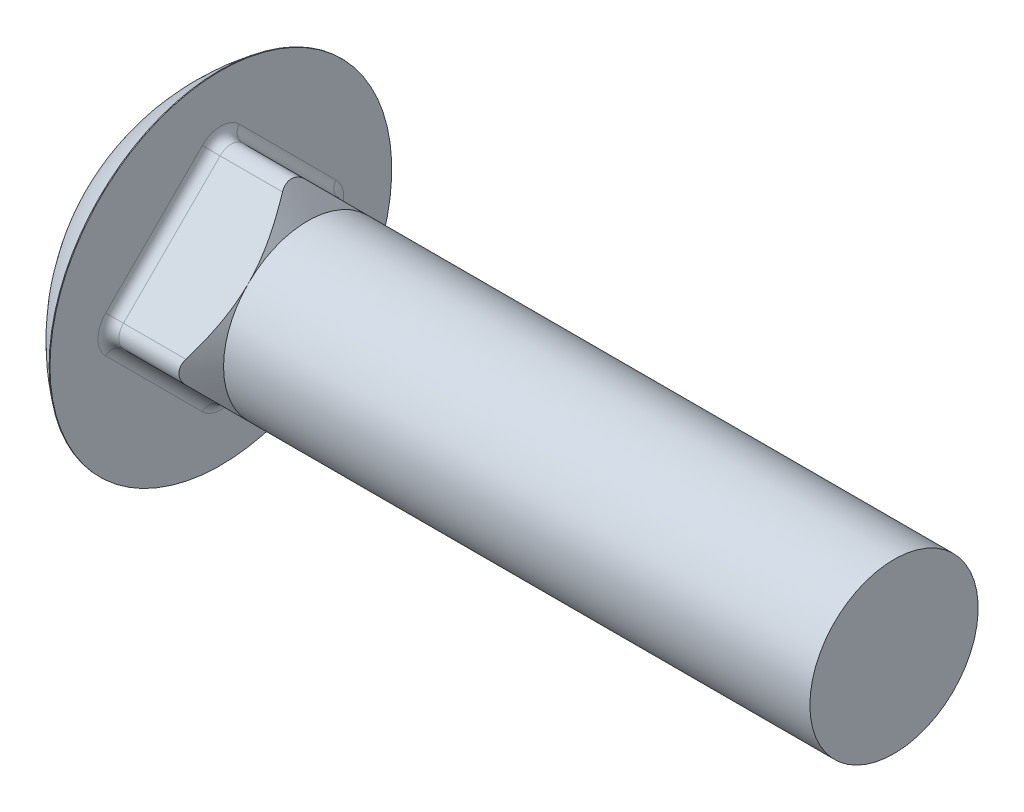
ISO-10303-21;
HEADER;
FILE_DESCRIPTION(('STEP AP214'),'2;1');
FILE_NAME('part.step','',(''),(''),'','','');
FILE_SCHEMA(('AUTOMOTIVE_DESIGN { 1 0 10303 214 1 1 1 1 }'));
ENDSEC;
DATA;
#1=APPLICATION_CONTEXT('core data for automotive mechanical design processes');
#2=APPLICATION_PROTOCOL_DEFINITION('international standard','automotive_design',2000,#1);
#3=PRODUCT_CONTEXT('',#1,'mechanical');
#4=PRODUCT('Part','Part','',(#3));
#5=PRODUCT_RELATED_PRODUCT_CATEGORY('part','',(#4));
#6=PRODUCT_DEFINITION_FORMATION('','',#4);
#7=PRODUCT_DEFINITION_CONTEXT('part definition',#1,'design');
#8=PRODUCT_DEFINITION('design','',#6,#7);
#9=PRODUCT_DEFINITION_SHAPE('','',#8);
#10=(LENGTH_UNIT() NAMED_UNIT(*) SI_UNIT(.MILLI.,.METRE.));
#11=(NAMED_UNIT(*) PLANE_ANGLE_UNIT() SI_UNIT($,.RADIAN.));
#12=(NAMED_UNIT(*) SI_UNIT($,.STERADIAN.) SOLID_ANGLE_UNIT());
#13=UNCERTAINTY_MEASURE_WITH_UNIT(LENGTH_MEASURE(1.E-05),#10,'distance_accuracy_value','');
#14=(GEOMETRIC_REPRESENTATION_CONTEXT(3) GLOBAL_UNCERTAINTY_ASSIGNED_CONTEXT((#13)) GLOBAL_UNIT_ASSIGNED_CONTEXT((#10,
#11,#12)) REPRESENTATION_CONTEXT('',''));
#15=CARTESIAN_POINT('',(0.,0.,0.));
#16=DIRECTION('',(0.,0.,1.));
#17=DIRECTION('',(1.,0.,0.));
#18=AXIS2_PLACEMENT_3D('',#15,#16,#17);
#19=CARTESIAN_POINT('',(26.2128,1.68828815076104,16.2722240913773));
#20=DIRECTION('',(0.,-0.707106781186549,-0.707106781186546));
#21=DIRECTION('',(0.,0.707106781186546,-0.707106781186549));
#22=AXIS2_PLACEMENT_3D('',#19,#20,#21);
#23=PLANE('',#22);
#24=CARTESIAN_POINT('',(24.0998422226061,16.2724240913773,1.68808815076099));
#25=CARTESIAN_POINT('',(24.1796497663241,16.1173593503386,1.84315289179968));
#26=CARTESIAN_POINT('',(24.2581086680873,15.9619481524108,1.99856408972748));
#27=CARTESIAN_POINT('',(24.4120519112658,15.6503819046025,2.31013033753579));
#28=CARTESIAN_POINT('',(24.4875360911834,15.4942268148506,2.46628542728773));
#29=CARTESIAN_POINT('',(24.7091843622185,15.024411094104,2.9361011480343));
#30=CARTESIAN_POINT('',(24.8504499810706,14.7095816606225,3.25093058151577));
#31=CARTESIAN_POINT('',(25.1181625544121,14.0744287731308,3.88608346900746));
#32=CARTESIAN_POINT('',(25.2445018329553,13.7540824903623,4.20642975177596));
#33=CARTESIAN_POINT('',(25.4780882689611,13.1099535310323,4.85055871110602));
#34=CARTESIAN_POINT('',(25.5853388036643,12.7861714731014,5.17434076903691));
#35=CARTESIAN_POINT('',(25.7734199603777,12.1487294147442,5.81178282739412));
#36=CARTESIAN_POINT('',(25.8551600718098,11.8352048620366,6.12530738010167));
#37=CARTESIAN_POINT('',(25.995092943184,11.2055045774641,6.75500766467424));
#38=CARTESIAN_POINT('',(26.0532856480782,10.889328839403,7.07118340273531));
#39=CARTESIAN_POINT('',(26.1435202976725,10.2561650101297,7.70434723200861));
#40=CARTESIAN_POINT('',(26.1756494035257,9.93918321240109,8.02132902973721));
#41=CARTESIAN_POINT('',(26.212576491319,9.30442489732251,8.6560873448158));
#42=CARTESIAN_POINT('',(26.2173758240739,8.98664842002746,8.97386382211085));
#43=CARTESIAN_POINT('',(26.2001253342302,8.37636377064582,9.58414847149249));
#44=CARTESIAN_POINT('',(26.1801479273766,8.08382492160529,9.87668732053302));
#45=CARTESIAN_POINT('',(26.1176102367563,7.49996676455735,10.460545477581));
#46=CARTESIAN_POINT('',(26.075049796802,7.20864746499858,10.7518647771397));
#47=CARTESIAN_POINT('',(25.9687884415338,6.62707683020091,11.3334354119374));
#48=CARTESIAN_POINT('',(25.905024499247,6.33683131919052,11.6236809229478));
#49=CARTESIAN_POINT('',(25.7585167900372,5.75877000181181,12.2017422403265));
#50=CARTESIAN_POINT('',(25.6757730364152,5.47095419374093,12.4895580483974));
#51=CARTESIAN_POINT('',(25.4899949346583,4.88652946168521,13.0739827804531));
#52=CARTESIAN_POINT('',(25.3862813330424,4.59002933887238,13.3704829032659));
#53=CARTESIAN_POINT('',(25.1634125275769,3.99992687621869,13.9605853659196));
#54=CARTESIAN_POINT('',(25.0442553755331,3.70632490701536,14.254187335123));
#55=CARTESIAN_POINT('',(24.793661752842,3.12373768188964,14.8367745602487));
#56=CARTESIAN_POINT('',(24.6623049117167,2.83473516709221,15.1257770750461));
#57=CARTESIAN_POINT('',(24.388733693837,2.25945449634379,15.7010577457945));
#58=CARTESIAN_POINT('',(24.2465244060377,1.9731751334172,15.9873371087211));
#59=CARTESIAN_POINT('',(24.0998422226061,1.68808815076105,16.2724240913773));
#60=B_SPLINE_CURVE_WITH_KNOTS('',3,(#24,#25,#26,#27,#28,#29,#30,#31,#32,#33,#34,#35,#36,#37,#38,
#39,#40,#41,#42,#43,#44,#45,#46,#47,#48,#49,#50,#51,#52,#53,#54,#55,#56,#57,#58,#59),
.UNSPECIFIED.,.F.,.F.,(4,2,2,2,2,2,2,2,2,2,2,2,2,2,2,2,2,4),(0.,0.700087936142533,
1.4002138278426,2.80128617447019,4.21191735287394,5.62229870935112,6.9743282125226,
8.32636087638132,9.67385325232222,11.0212790258671,12.2632245400693,13.5051786438624,
14.7508579315153,15.9965363462096,17.2920436930866,18.5877146267493,19.8754544384806,
21.162594067472),.UNSPECIFIED.);
#61=CARTESIAN_POINT('',(24.0999451606165,16.2722240913773,1.68828815076098));
#62=VERTEX_POINT('',#61);
#63=CARTESIAN_POINT('',(26.2128,8.98025612106916,8.98025612106913));
#64=VERTEX_POINT('',#63);
#65=EDGE_CURVE('E51',#62,#64,#60,.T.);
#66=ORIENTED_EDGE('',*,*,#65,.F.);
#67=DIRECTION('',(-1.,0.,0.));
#68=VECTOR('',#67,1.);
#69=CARTESIAN_POINT('',(26.2128,16.2722240913773,1.68828815076098));
#70=LINE('',#69,#68);
#71=CARTESIAN_POINT('',(14.6812,16.2722240913773,1.68828815076098));
#72=VERTEX_POINT('',#71);
#73=EDGE_CURVE('E298',#62,#72,#70,.T.);
#74=ORIENTED_EDGE('',*,*,#73,.T.);
#75=DIRECTION('',(0.,0.707106781186546,-0.707106781186549));
#76=VECTOR('',#75,1.);
#77=CARTESIAN_POINT('',(14.6812,1.68828815076104,16.2722240913773));
#78=LINE('',#77,#76);
#79=CARTESIAN_POINT('',(14.6812,1.68828815076104,16.2722240913773));
#80=VERTEX_POINT('',#79);
#81=EDGE_CURVE('E43',#72,#80,#78,.F.);
#82=ORIENTED_EDGE('',*,*,#81,.T.);
#83=DIRECTION('',(-1.,0.,0.));
#84=VECTOR('',#83,1.);
#85=CARTESIAN_POINT('',(26.2128,1.68828815076104,16.2722240913773));
#86=LINE('',#85,#84);
#87=CARTESIAN_POINT('',(24.0999451606165,1.68828815076104,16.2722240913773));
#88=VERTEX_POINT('',#87);
#89=EDGE_CURVE('E306',#88,#80,#86,.T.);
#90=ORIENTED_EDGE('',*,*,#89,.F.);
#91=EDGE_CURVE('E227',#64,#88,#60,.T.);
#92=ORIENTED_EDGE('',*,*,#91,.F.);
#93=EDGE_LOOP('',(#66,#74,#82,#90,#92));
#94=FACE_BOUND('',#93,.T.);
#95=ADVANCED_FACE('F34',(#94),#23,.F.);
#96=CARTESIAN_POINT('',(26.2128,-16.2722240913773,1.68828815076104));
#97=DIRECTION('',(0.,0.707106781186546,-0.707106781186549));
#98=DIRECTION('',(0.,0.707106781186549,0.707106781186546));
#99=AXIS2_PLACEMENT_3D('',#96,#97,#98);
#100=PLANE('',#99);
#101=CARTESIAN_POINT('',(24.0998422226061,-1.68808815076098,16.2724240913773));
#102=CARTESIAN_POINT('',(24.1796497663241,-1.84315289179967,16.1173593503386));
#103=CARTESIAN_POINT('',(24.2581086680873,-1.99856408972748,15.9619481524108));
#104=CARTESIAN_POINT('',(24.4120519112658,-2.31013033753579,15.6503819046025));
#105=CARTESIAN_POINT('',(24.4875360911834,-2.46628542728773,15.4942268148506));
#106=CARTESIAN_POINT('',(24.7091843622185,-2.93610114803431,15.024411094104));
#107=CARTESIAN_POINT('',(24.8504499810706,-3.25093058151577,14.7095816606225));
#108=CARTESIAN_POINT('',(25.118162554412,-3.88608346900746,14.0744287731308));
#109=CARTESIAN_POINT('',(25.2445018329553,-4.20642975177596,13.7540824903623));
#110=CARTESIAN_POINT('',(25.4780882689611,-4.85055871110602,13.1099535310323));
#111=CARTESIAN_POINT('',(25.5853388036643,-5.17434076903691,12.7861714731014));
#112=CARTESIAN_POINT('',(25.7734199603777,-5.81178282739413,12.1487294147442));
#113=CARTESIAN_POINT('',(25.8551600718098,-6.12530738010168,11.8352048620366));
#114=CARTESIAN_POINT('',(25.995092943184,-6.75500766467425,11.2055045774641));
#115=CARTESIAN_POINT('',(26.0532856480782,-7.07118340273531,10.889328839403));
#116=CARTESIAN_POINT('',(26.1435202976725,-7.70434723200862,10.2561650101297));
#117=CARTESIAN_POINT('',(26.1756494035257,-8.02132902973722,9.93918321240109));
#118=CARTESIAN_POINT('',(26.212576491319,-8.65608734481581,9.3044248973225));
#119=CARTESIAN_POINT('',(26.2173758240739,-8.97386382211085,8.98664842002745));
#120=CARTESIAN_POINT('',(26.2001253342302,-9.5841484714925,8.37636377064581));
#121=CARTESIAN_POINT('',(26.1801479273766,-9.87668732053303,8.08382492160528));
#122=CARTESIAN_POINT('',(26.1176102367563,-10.460545477581,7.49996676455735));
#123=CARTESIAN_POINT('',(26.075049796802,-10.7518647771397,7.20864746499857));
#124=CARTESIAN_POINT('',(25.9687884415338,-11.3334354119374,6.62707683020091));
#125=CARTESIAN_POINT('',(25.905024499247,-11.6236809229478,6.33683131919051));
#126=CARTESIAN_POINT('',(25.7585167900372,-12.2017422403265,5.7587700018118));
#127=CARTESIAN_POINT('',(25.6757730364152,-12.4895580483974,5.47095419374092));
#128=CARTESIAN_POINT('',(25.4899949346582,-13.0739827804531,4.8865294616852));
#129=CARTESIAN_POINT('',(25.3862813330424,-13.3704829032659,4.59002933887237));
#130=CARTESIAN_POINT('',(25.1634125275769,-13.9605853659196,3.99992687621868));
#131=CARTESIAN_POINT('',(25.0442553755331,-14.254187335123,3.70632490701535));
#132=CARTESIAN_POINT('',(24.793661752842,-14.8367745602487,3.12373768188963));
#133=CARTESIAN_POINT('',(24.6623049117167,-15.1257770750461,2.83473516709221));
#134=CARTESIAN_POINT('',(24.388733693837,-15.7010577457945,2.25945449634378));
#135=CARTESIAN_POINT('',(24.2465244060377,-15.9873371087211,1.97317513341719));
#136=CARTESIAN_POINT('',(24.0998422226061,-16.2724240913773,1.68808815076104));
#137=B_SPLINE_CURVE_WITH_KNOTS('',3,(#101,#102,#103,#104,#105,#106,#107,#108,#109,#110,#111,
#112,#113,#114,#115,#116,#117,#118,#119,#120,#121,#122,#123,#124,#125,#126,#127,#128,#129,#130,
#131,#132,#133,#134,#135,#136),.UNSPECIFIED.,.F.,.F.,(4,2,2,2,2,2,2,2,2,2,2,2,2,2,2,2,2,4),(0.,
0.700087936142534,1.4002138278426,2.80128617447019,4.21191735287394,5.62229870935113,
6.97432821252261,8.32636087638133,9.67385325232223,11.0212790258671,12.2632245400693,
13.5051786438624,14.7508579315153,15.9965363462096,17.2920436930866,18.5877146267493,
19.8754544384806,21.162594067472),.UNSPECIFIED.);
#138=CARTESIAN_POINT('',(24.0999451606165,-1.68828815076098,16.2722240913773));
#139=VERTEX_POINT('',#138);
#140=CARTESIAN_POINT('',(26.2128,-8.98025612106912,8.98025612106915));
#141=VERTEX_POINT('',#140);
#142=EDGE_CURVE('E136',#139,#141,#137,.T.);
#143=ORIENTED_EDGE('',*,*,#142,.F.);
#144=DIRECTION('',(-1.,0.,0.));
#145=VECTOR('',#144,1.);
#146=CARTESIAN_POINT('',(26.2128,-1.68828815076098,16.2722240913773));
#147=LINE('',#146,#145);
#148=CARTESIAN_POINT('',(14.6812,-1.68828815076098,16.2722240913773));
#149=VERTEX_POINT('',#148);
#150=EDGE_CURVE('E311',#139,#149,#147,.T.);
#151=ORIENTED_EDGE('',*,*,#150,.T.);
#152=DIRECTION('',(0.,0.707106781186549,0.707106781186546));
#153=VECTOR('',#152,1.);
#154=CARTESIAN_POINT('',(14.6812,-16.2722240913773,1.68828815076104));
#155=LINE('',#154,#153);
#156=CARTESIAN_POINT('',(14.6812,-16.2722240913773,1.68828815076104));
#157=VERTEX_POINT('',#156);
#158=EDGE_CURVE('E341',#149,#157,#155,.F.);
#159=ORIENTED_EDGE('',*,*,#158,.T.);
#160=DIRECTION('',(-1.,0.,0.));
#161=VECTOR('',#160,1.);
#162=CARTESIAN_POINT('',(26.2128,-16.2722240913773,1.68828815076104));
#163=LINE('',#162,#161);
#164=CARTESIAN_POINT('',(24.0999451606165,-16.2722240913773,1.68828815076104));
#165=VERTEX_POINT('',#164);
#166=EDGE_CURVE('E171',#165,#157,#163,.T.);
#167=ORIENTED_EDGE('',*,*,#166,.F.);
#168=EDGE_CURVE('E147',#141,#165,#137,.T.);
#169=ORIENTED_EDGE('',*,*,#168,.F.);
#170=EDGE_LOOP('',(#143,#151,#159,#167,#169));
#171=FACE_BOUND('',#170,.T.);
#172=ADVANCED_FACE('F169',(#171),#100,.F.);
#173=CARTESIAN_POINT('',(26.2128,-16.2722240913773,-1.68828815076098));
#174=DIRECTION('',(0.,0.707106781186549,0.707106781186546));
#175=DIRECTION('',(0.,-0.707106781186546,0.707106781186549));
#176=AXIS2_PLACEMENT_3D('',#173,#174,#175);
#177=PLANE('',#176);
#178=CARTESIAN_POINT('',(24.0998422226061,-16.2724240913773,-1.68808815076099));
#179=CARTESIAN_POINT('',(24.1796497663241,-16.1173593503386,-1.84315289179968));
#180=CARTESIAN_POINT('',(24.2581086680873,-15.9619481524108,-1.99856408972748));
#181=CARTESIAN_POINT('',(24.4120519112658,-15.6503819046025,-2.31013033753579));
#182=CARTESIAN_POINT('',(24.4875360911834,-15.4942268148505,-2.46628542728773));
#183=CARTESIAN_POINT('',(24.7091843622185,-15.024411094104,-2.93610114803431));
#184=CARTESIAN_POINT('',(24.8504499810706,-14.7095816606225,-3.25093058151577));
#185=CARTESIAN_POINT('',(25.1181625544121,-14.0744287731308,-3.88608346900746));
#186=CARTESIAN_POINT('',(25.2445018329553,-13.7540824903623,-4.20642975177597));
#187=CARTESIAN_POINT('',(25.4780882689611,-13.1099535310323,-4.85055871110602));
#188=CARTESIAN_POINT('',(25.5853388036643,-12.7861714731014,-5.17434076903691));
#189=CARTESIAN_POINT('',(25.7734199603777,-12.1487294147442,-5.81178282739414));
#190=CARTESIAN_POINT('',(25.8551600718098,-11.8352048620366,-6.12530738010168));
#191=CARTESIAN_POINT('',(25.995092943184,-11.205504577464,-6.75500766467426));
#192=CARTESIAN_POINT('',(26.0532856480782,-10.889328839403,-7.07118340273533));
#193=CARTESIAN_POINT('',(26.1435202976725,-10.2561650101297,-7.70434723200863));
#194=CARTESIAN_POINT('',(26.1756494035257,-9.93918321240107,-8.02132902973723));
#195=CARTESIAN_POINT('',(26.212576491319,-9.30442489732249,-8.65608734481582));
#196=CARTESIAN_POINT('',(26.2173758240739,-8.98664842002744,-8.97386382211087));
#197=CARTESIAN_POINT('',(26.2001253342302,-8.3763637706458,-9.58414847149251));
#198=CARTESIAN_POINT('',(26.1801479273766,-8.08382492160527,-9.87668732053304));
#199=CARTESIAN_POINT('',(26.1176102367563,-7.49996676455733,-10.460545477581));
#200=CARTESIAN_POINT('',(26.075049796802,-7.20864746499856,-10.7518647771398));
#201=CARTESIAN_POINT('',(25.9687884415338,-6.6270768302009,-11.3334354119374));
#202=CARTESIAN_POINT('',(25.905024499247,-6.3368313191905,-11.6236809229478));
#203=CARTESIAN_POINT('',(25.7585167900372,-5.7587700018118,-12.2017422403265));
#204=CARTESIAN_POINT('',(25.6757730364152,-5.47095419374091,-12.4895580483974));
#205=CARTESIAN_POINT('',(25.4899949346582,-4.88652946168519,-13.0739827804531));
#206=CARTESIAN_POINT('',(25.3862813330424,-4.59002933887237,-13.370482903266));
#207=CARTESIAN_POINT('',(25.1634125275769,-3.99992687621868,-13.9605853659196));
#208=CARTESIAN_POINT('',(25.0442553755331,-3.70632490701535,-14.254187335123));
#209=CARTESIAN_POINT('',(24.793661752842,-3.12373768188963,-14.8367745602487));
#210=CARTESIAN_POINT('',(24.6623049117167,-2.83473516709221,-15.1257770750461));
#211=CARTESIAN_POINT('',(24.388733693837,-2.25945449634378,-15.7010577457945));
#212=CARTESIAN_POINT('',(24.2465244060377,-1.97317513341719,-15.9873371087211));
#213=CARTESIAN_POINT('',(24.0998422226061,-1.68808815076104,-16.2724240913773));
#214=B_SPLINE_CURVE_WITH_KNOTS('',3,(#178,#179,#180,#181,#182,#183,#184,#185,#186,#187,#188,
#189,#190,#191,#192,#193,#194,#195,#196,#197,#198,#199,#200,#201,#202,#203,#204,#205,#206,#207,
#208,#209,#210,#211,#212,#213),.UNSPECIFIED.,.F.,.F.,(4,2,2,2,2,2,2,2,2,2,2,2,2,2,2,2,2,4),(0.,
0.700087936142533,1.4002138278426,2.80128617447019,4.21191735287394,5.62229870935114,
6.97432821252261,8.32636087638134,9.67385325232224,11.0212790258671,12.2632245400693,
13.5051786438624,14.7508579315153,15.9965363462096,17.2920436930866,18.5877146267493,
19.8754544384806,21.162594067472),.UNSPECIFIED.);
#215=CARTESIAN_POINT('',(24.0999451606165,-16.2722240913773,-1.68828815076098));
#216=VERTEX_POINT('',#215);
#217=CARTESIAN_POINT('',(26.2128,-8.98025612106915,-8.98025612106911));
#218=VERTEX_POINT('',#217);
#219=EDGE_CURVE('E156',#216,#218,#214,.T.);
#220=ORIENTED_EDGE('',*,*,#219,.F.);
#221=DIRECTION('',(-1.,0.,0.));
#222=VECTOR('',#221,1.);
#223=CARTESIAN_POINT('',(26.2128,-16.2722240913773,-1.68828815076098));
#224=LINE('',#223,#222);
#225=CARTESIAN_POINT('',(14.6812,-16.2722240913773,-1.68828815076098));
#226=VERTEX_POINT('',#225);
#227=EDGE_CURVE('E381',#216,#226,#224,.T.);
#228=ORIENTED_EDGE('',*,*,#227,.T.);
#229=DIRECTION('',(0.,-0.707106781186546,0.707106781186549));
#230=VECTOR('',#229,1.);
#231=CARTESIAN_POINT('',(14.6812,-16.2722240913773,-1.68828815076098));
#232=LINE('',#231,#230);
#233=CARTESIAN_POINT('',(14.6812,-1.68828815076104,-16.2722240913773));
#234=VERTEX_POINT('',#233);
#235=EDGE_CURVE('E338',#226,#234,#232,.F.);
#236=ORIENTED_EDGE('',*,*,#235,.T.);
#237=DIRECTION('',(-1.,0.,0.));
#238=VECTOR('',#237,1.);
#239=CARTESIAN_POINT('',(26.2128,-1.68828815076104,-16.2722240913773));
#240=LINE('',#239,#238);
#241=CARTESIAN_POINT('',(24.0999451606165,-1.68828815076104,-16.2722240913773));
#242=VERTEX_POINT('',#241);
#243=EDGE_CURVE('E377',#242,#234,#240,.T.);
#244=ORIENTED_EDGE('',*,*,#243,.F.);
#245=EDGE_CURVE('E215',#218,#242,#214,.T.);
#246=ORIENTED_EDGE('',*,*,#245,.F.);
#247=EDGE_LOOP('',(#220,#228,#236,#244,#246));
#248=FACE_BOUND('',#247,.T.);
#249=ADVANCED_FACE('F295',(#248),#177,.F.);
#250=CARTESIAN_POINT('',(26.2128,1.68828815076098,-16.2722240913773));
#251=DIRECTION('',(0.,-0.707106781186546,0.707106781186549));
#252=DIRECTION('',(0.,-0.707106781186549,-0.707106781186546));
#253=AXIS2_PLACEMENT_3D('',#250,#251,#252);
#254=PLANE('',#253);
#255=CARTESIAN_POINT('',(24.0998422226061,1.68808815076099,-16.2724240913773));
#256=CARTESIAN_POINT('',(24.1796497663241,1.84315289179968,-16.1173593503386));
#257=CARTESIAN_POINT('',(24.2581086680873,1.99856408972748,-15.9619481524108));
#258=CARTESIAN_POINT('',(24.4120519112658,2.31013033753579,-15.6503819046025));
#259=CARTESIAN_POINT('',(24.4875360911834,2.46628542728773,-15.4942268148506));
#260=CARTESIAN_POINT('',(24.7091843622185,2.93610114803431,-15.024411094104));
#261=CARTESIAN_POINT('',(24.8504499810706,3.25093058151577,-14.7095816606225));
#262=CARTESIAN_POINT('',(25.1181625544121,3.88608346900746,-14.0744287731308));
#263=CARTESIAN_POINT('',(25.2445018329553,4.20642975177597,-13.7540824903623));
#264=CARTESIAN_POINT('',(25.4780882689611,4.85055871110602,-13.1099535310323));
#265=CARTESIAN_POINT('',(25.5853388036643,5.17434076903691,-12.7861714731014));
#266=CARTESIAN_POINT('',(25.7734199603777,5.81178282739413,-12.1487294147442));
#267=CARTESIAN_POINT('',(25.8551600718098,6.12530738010168,-11.8352048620366));
#268=CARTESIAN_POINT('',(25.995092943184,6.75500766467426,-11.205504577464));
#269=CARTESIAN_POINT('',(26.0532856480782,7.07118340273532,-10.889328839403));
#270=CARTESIAN_POINT('',(26.1435202976725,7.70434723200862,-10.2561650101297));
#271=CARTESIAN_POINT('',(26.1756494035257,8.02132902973723,-9.93918321240108));
#272=CARTESIAN_POINT('',(26.212576491319,8.65608734481581,-9.30442489732249));
#273=CARTESIAN_POINT('',(26.2173758240739,8.97386382211086,-8.98664842002744));
#274=CARTESIAN_POINT('',(26.2001253342302,9.5841484714925,-8.3763637706458));
#275=CARTESIAN_POINT('',(26.1801479273766,9.87668732053304,-8.08382492160527));
#276=CARTESIAN_POINT('',(26.1176102367563,10.460545477581,-7.49996676455734));
#277=CARTESIAN_POINT('',(26.075049796802,10.7518647771398,-7.20864746499856));
#278=CARTESIAN_POINT('',(25.9687884415338,11.3334354119374,-6.6270768302009));
#279=CARTESIAN_POINT('',(25.905024499247,11.6236809229478,-6.33683131919051));
#280=CARTESIAN_POINT('',(25.7585167900372,12.2017422403265,-5.7587700018118));
#281=CARTESIAN_POINT('',(25.6757730364152,12.4895580483974,-5.47095419374091));
#282=CARTESIAN_POINT('',(25.4899949346583,13.0739827804531,-4.88652946168519));
#283=CARTESIAN_POINT('',(25.3862813330424,13.370482903266,-4.59002933887237));
#284=CARTESIAN_POINT('',(25.1634125275769,13.9605853659196,-3.99992687621868));
#285=CARTESIAN_POINT('',(25.0442553755331,14.254187335123,-3.70632490701535));
#286=CARTESIAN_POINT('',(24.793661752842,14.8367745602487,-3.12373768188963));
#287=CARTESIAN_POINT('',(24.6623049117167,15.1257770750461,-2.83473516709221));
#288=CARTESIAN_POINT('',(24.388733693837,15.7010577457945,-2.25945449634378));
#289=CARTESIAN_POINT('',(24.2465244060377,15.9873371087211,-1.97317513341719));
#290=CARTESIAN_POINT('',(24.0998422226061,16.2724240913773,-1.68808815076104));
#291=B_SPLINE_CURVE_WITH_KNOTS('',3,(#255,#256,#257,#258,#259,#260,#261,#262,#263,#264,#265,
#266,#267,#268,#269,#270,#271,#272,#273,#274,#275,#276,#277,#278,#279,#280,#281,#282,#283,#284,
#285,#286,#287,#288,#289,#290),.UNSPECIFIED.,.F.,.F.,(4,2,2,2,2,2,2,2,2,2,2,2,2,2,2,2,2,4),(0.,
0.700087936142533,1.4002138278426,2.80128617447019,4.21191735287394,5.62229870935113,
6.97432821252261,8.32636087638133,9.67385325232224,11.0212790258671,12.2632245400693,
13.5051786438624,14.7508579315153,15.9965363462096,17.2920436930866,18.5877146267493,
19.8754544384806,21.162594067472),.UNSPECIFIED.);
#292=CARTESIAN_POINT('',(24.0999451606165,1.68828815076098,-16.2722240913773));
#293=VERTEX_POINT('',#292);
#294=CARTESIAN_POINT('',(26.2128,8.98025612106913,-8.98025612106916));
#295=VERTEX_POINT('',#294);
#296=EDGE_CURVE('E59',#293,#295,#291,.T.);
#297=ORIENTED_EDGE('',*,*,#296,.F.);
#298=DIRECTION('',(-1.,0.,0.));
#299=VECTOR('',#298,1.);
#300=CARTESIAN_POINT('',(26.2128,1.68828815076099,-16.2722240913773));
#301=LINE('',#300,#299);
#302=CARTESIAN_POINT('',(14.6812,1.68828815076099,-16.2722240913773));
#303=VERTEX_POINT('',#302);
#304=EDGE_CURVE('E376',#293,#303,#301,.T.);
#305=ORIENTED_EDGE('',*,*,#304,.T.);
#306=DIRECTION('',(0.,-0.707106781186549,-0.707106781186546));
#307=VECTOR('',#306,1.);
#308=CARTESIAN_POINT('',(14.6812,1.68828815076098,-16.2722240913773));
#309=LINE('',#308,#307);
#310=CARTESIAN_POINT('',(14.6812,16.2722240913773,-1.68828815076104));
#311=VERTEX_POINT('',#310);
#312=EDGE_CURVE('E349',#303,#311,#309,.F.);
#313=ORIENTED_EDGE('',*,*,#312,.T.);
#314=DIRECTION('',(-1.,0.,0.));
#315=VECTOR('',#314,1.);
#316=CARTESIAN_POINT('',(26.2128,16.2722240913773,-1.68828815076104));
#317=LINE('',#316,#315);
#318=CARTESIAN_POINT('',(24.0999451606165,16.2722240913773,-1.68828815076104));
#319=VERTEX_POINT('',#318);
#320=EDGE_CURVE('E373',#319,#311,#317,.T.);
#321=ORIENTED_EDGE('',*,*,#320,.F.);
#322=EDGE_CURVE('E172',#295,#319,#291,.T.);
#323=ORIENTED_EDGE('',*,*,#322,.F.);
#324=EDGE_LOOP('',(#297,#305,#313,#321,#323));
#325=FACE_BOUND('',#324,.T.);
#326=ADVANCED_FACE('F198',(#325),#254,.F.);
#327=CARTESIAN_POINT('',(26.2128,14.5839359406163,0.));
#328=DIRECTION('',(-1.,0.,0.));
#329=DIRECTION('',(0.,0.,1.));
#330=AXIS2_PLACEMENT_3D('',#327,#328,#329);
#331=CYLINDRICAL_SURFACE('',#330,2.3876);
#332=CARTESIAN_POINT('',(24.1000480983371,16.2720240913773,-1.68848812707121));
#333=CARTESIAN_POINT('',(24.0775747641464,16.3156876423239,-1.64483319813253));
#334=CARTESIAN_POINT('',(24.0559490449275,16.3578605284905,-1.59928246735106));
#335=CARTESIAN_POINT('',(24.0145185034387,16.4389088311236,-1.50452779383983));
#336=CARTESIAN_POINT('',(23.994714470413,16.4777828177844,-1.45532228421109));
#337=CARTESIAN_POINT('',(23.9381956378565,16.5890372482357,-1.3023388270512));
#338=CARTESIAN_POINT('',(23.904441816004,16.6559181776764,-1.19332482860328));
#339=CARTESIAN_POINT('',(23.8459816030701,16.7722032562056,-0.963712259300428));
#340=CARTESIAN_POINT('',(23.821301370553,16.8215568614625,-0.843081440169895));
#341=CARTESIAN_POINT('',(23.782092858447,16.9001411590001,-0.593999849255904));
#342=CARTESIAN_POINT('',(23.7675500612228,16.9294006268336,-0.46556054783862));
#343=CARTESIAN_POINT('',(23.7497092724347,16.9653177382716,-0.212312782339078));
#344=CARTESIAN_POINT('',(23.7458179808139,16.9731678093147,-0.0877141956908524));
#345=CARTESIAN_POINT('',(23.7477169551136,16.9693401352831,0.161100191750121));
#346=CARTESIAN_POINT('',(23.7535058393249,16.9576651771323,0.285316044637432));
#347=CARTESIAN_POINT('',(23.7741981359826,16.9160322350612,0.525705819848533));
#348=CARTESIAN_POINT('',(23.7888039247388,16.8866713252579,0.642009887216439));
#349=CARTESIAN_POINT('',(23.8263649440061,16.8114340983449,0.867797760182133));
#350=CARTESIAN_POINT('',(23.8493283056,16.7655416981951,0.977274801853874));
#351=CARTESIAN_POINT('',(23.9052274866224,16.6543604140197,1.19594287540346));
#352=CARTESIAN_POINT('',(23.9388573471629,16.5877309239635,1.3042795934595));
#353=CARTESIAN_POINT('',(23.9951416661081,16.4769438314699,1.45640206359317));
#354=CARTESIAN_POINT('',(24.0148723839985,16.4382154085788,1.50537143227244));
#355=CARTESIAN_POINT('',(24.0561385321799,16.3574910059531,1.59968116747488));
#356=CARTESIAN_POINT('',(24.0776730593191,16.3154966621817,1.64502332813833));
#357=CARTESIAN_POINT('',(24.1000480983371,16.2720240913773,1.68848812707116));
#358=B_SPLINE_CURVE_WITH_KNOTS('',3,(#332,#333,#334,#335,#336,#337,#338,#339,#340,#341,#342,
#343,#344,#345,#346,#347,#348,#349,#350,#351,#352,#353,#354,#355,#356,#357),.UNSPECIFIED.,.F.,
.F.,(4,2,2,2,2,2,2,2,2,2,2,2,4),(0.,0.197020896451375,0.394126753950168,0.788924957480996,
1.18485257524356,1.58021202096615,1.95305265103825,2.32584006788412,2.68669707021443,
3.04790609293942,3.4405552282553,3.63681089371977,3.83296887638749),.UNSPECIFIED.);
#359=EDGE_CURVE('E222',#319,#62,#358,.T.);
#360=ORIENTED_EDGE('',*,*,#359,.F.);
#361=ORIENTED_EDGE('',*,*,#320,.T.);
#362=CARTESIAN_POINT('',(14.6812,14.5839359406163,0.));
#363=DIRECTION('',(1.,0.,0.));
#364=DIRECTION('',(0.,0.,-1.));
#365=AXIS2_PLACEMENT_3D('',#362,#363,#364);
#366=CIRCLE('',#365,2.3876);
#367=EDGE_CURVE('E11',#311,#72,#366,.T.);
#368=ORIENTED_EDGE('',*,*,#367,.T.);
#369=ORIENTED_EDGE('',*,*,#73,.F.);
#370=EDGE_LOOP('',(#360,#361,#368,#369));
#371=FACE_BOUND('',#370,.T.);
#372=ADVANCED_FACE('F233',(#371),#331,.T.);
#373=CARTESIAN_POINT('',(26.2128,0.,14.5839359406163));
#374=DIRECTION('',(-1.,0.,0.));
#375=DIRECTION('',(0.,0.,1.));
#376=AXIS2_PLACEMENT_3D('',#373,#374,#375);
#377=CYLINDRICAL_SURFACE('',#376,2.3876);
#378=CARTESIAN_POINT('',(24.100048110533,1.68848815076104,16.2720240676818));
#379=CARTESIAN_POINT('',(24.077574775947,1.64483322233626,16.3156876193399));
#380=CARTESIAN_POINT('',(24.0559490563263,1.59928249203864,16.3578605062384));
#381=CARTESIAN_POINT('',(24.0145185140218,1.50452781942918,16.4389088103735));
#382=CARTESIAN_POINT('',(23.9947144805823,1.4553223102183,16.4777827978044));
#383=CARTESIAN_POINT('',(23.9381956467649,1.30233885419684,16.5890372306243));
#384=CARTESIAN_POINT('',(23.9044418240511,1.19332485636042,16.6559181617127));
#385=CARTESIAN_POINT('',(23.8459816093788,0.963712287942624,16.7722032436133));
#386=CARTESIAN_POINT('',(23.8213013759851,0.843081469084295,16.8215568505935));
#387=CARTESIAN_POINT('',(23.782092862149,0.593999878353601,16.9001411515619));
#388=CARTESIAN_POINT('',(23.7675500640711,0.465560576848065,16.9294006211032));
#389=CARTESIAN_POINT('',(23.7497092736969,0.212312811034251,16.965317735727));
#390=CARTESIAN_POINT('',(23.7458179813247,0.0877142241850954,16.9731678082854));
#391=CARTESIAN_POINT('',(23.7477169541735,-0.16110016393616,16.9693401371779));
#392=CARTESIAN_POINT('',(23.7535058376847,-0.285316017302806,16.9576651804373));
#393=CARTESIAN_POINT('',(23.7741981330151,-0.525705793391465,16.9160322410272));
#394=CARTESIAN_POINT('',(23.7888039211187,-0.642009861159929,16.8866713325257));
#395=CARTESIAN_POINT('',(23.8263649391266,-0.867797735153144,16.8114341081026));
#396=CARTESIAN_POINT('',(23.849328300115,-0.977274777450873,16.7655417091379));
#397=CARTESIAN_POINT('',(23.9052274822704,-1.19594286157787,16.6543604226395));
#398=CARTESIAN_POINT('',(23.9388573452749,-1.30427958871854,16.5877309276706));
#399=CARTESIAN_POINT('',(23.9951416688458,-1.45640207081097,16.4769438260857));
#400=CARTESIAN_POINT('',(24.0148723884403,-1.50537144321272,16.438215399863));
#401=CARTESIAN_POINT('',(24.0561385403021,-1.59968118525038,16.3574909900911));
#402=CARTESIAN_POINT('',(24.0776730694171,-1.6450233490275,16.315496642506));
#403=CARTESIAN_POINT('',(24.100048110533,-1.68848815076098,16.2720240676819));
#404=B_SPLINE_CURVE_WITH_KNOTS('',3,(#378,#379,#380,#381,#382,#383,#384,#385,#386,#387,#388,
#389,#390,#391,#392,#393,#394,#395,#396,#397,#398,#399,#400,#401,#402,#403),.UNSPECIFIED.,.F.,
.F.,(4,2,2,2,2,2,2,2,2,2,2,2,4),(0.,0.197020897250565,0.39412675555023,0.78892496071948,
1.18485258013927,1.58021202751015,1.95305265852731,2.32584007629413,2.68669707858472,
3.04790610133116,3.44055526792403,3.63681094915389,3.83296894754415),.UNSPECIFIED.);
#405=EDGE_CURVE('E143',#88,#139,#404,.T.);
#406=ORIENTED_EDGE('',*,*,#405,.F.);
#407=ORIENTED_EDGE('',*,*,#89,.T.);
#408=CARTESIAN_POINT('',(14.6812,0.,14.5839359406163));
#409=DIRECTION('',(1.,0.,0.));
#410=DIRECTION('',(0.,0.,-1.));
#411=AXIS2_PLACEMENT_3D('',#408,#409,#410);
#412=CIRCLE('',#411,2.3876);
#413=EDGE_CURVE('E346',#80,#149,#412,.T.);
#414=ORIENTED_EDGE('',*,*,#413,.T.);
#415=ORIENTED_EDGE('',*,*,#150,.F.);
#416=EDGE_LOOP('',(#406,#407,#414,#415));
#417=FACE_BOUND('',#416,.T.);
#418=ADVANCED_FACE('F237',(#417),#377,.T.);
#419=CARTESIAN_POINT('',(26.2128,-14.5839359406163,0.));
#420=DIRECTION('',(-1.,0.,0.));
#421=DIRECTION('',(0.,0.,1.));
#422=AXIS2_PLACEMENT_3D('',#419,#420,#421);
#423=CYLINDRICAL_SURFACE('',#422,2.3876);
#424=CARTESIAN_POINT('',(24.1000480983371,-16.2720240913773,1.68848812707121));
#425=CARTESIAN_POINT('',(24.0775747641464,-16.3156876423239,1.64483319813253));
#426=CARTESIAN_POINT('',(24.0559490449275,-16.3578605284905,1.59928246735106));
#427=CARTESIAN_POINT('',(24.0145185034387,-16.4389088311236,1.50452779383983));
#428=CARTESIAN_POINT('',(23.994714470413,-16.4777828177844,1.45532228421109));
#429=CARTESIAN_POINT('',(23.9381956378565,-16.5890372482357,1.3023388270512));
#430=CARTESIAN_POINT('',(23.904441816004,-16.6559181776764,1.19332482860328));
#431=CARTESIAN_POINT('',(23.8459816030701,-16.7722032562056,0.963712259300425));
#432=CARTESIAN_POINT('',(23.821301370553,-16.8215568614625,0.843081440169891));
#433=CARTESIAN_POINT('',(23.782092858447,-16.9001411590001,0.5939998492559));
#434=CARTESIAN_POINT('',(23.7675500612228,-16.9294006268336,0.465560547838616));
#435=CARTESIAN_POINT('',(23.7497092724347,-16.9653177382716,0.212312782339074));
#436=CARTESIAN_POINT('',(23.7458179808139,-16.9731678093147,0.0877141956908489));
#437=CARTESIAN_POINT('',(23.7477169551136,-16.9693401352831,-0.161100191750124));
#438=CARTESIAN_POINT('',(23.7535058393249,-16.9576651771323,-0.285316044637435));
#439=CARTESIAN_POINT('',(23.7741981359826,-16.9160322350612,-0.525705819848535));
#440=CARTESIAN_POINT('',(23.7888039247388,-16.8866713252579,-0.64200988721644));
#441=CARTESIAN_POINT('',(23.8263649440061,-16.8114340983449,-0.867797760182135));
#442=CARTESIAN_POINT('',(23.8493283056,-16.7655416981951,-0.977274801853876));
#443=CARTESIAN_POINT('',(23.9052274866224,-16.6543604140197,-1.19594287540346));
#444=CARTESIAN_POINT('',(23.9388573471629,-16.5877309239635,-1.3042795934595));
#445=CARTESIAN_POINT('',(23.9951416661081,-16.4769438314699,-1.45640206359317));
#446=CARTESIAN_POINT('',(24.0148723839985,-16.4382154085788,-1.50537143227244));
#447=CARTESIAN_POINT('',(24.0561385321799,-16.3574910059531,-1.59968116747488));
#448=CARTESIAN_POINT('',(24.0776730593191,-16.3154966621817,-1.64502332813833));
#449=CARTESIAN_POINT('',(24.1000480983371,-16.2720240913773,-1.68848812707116));
#450=B_SPLINE_CURVE_WITH_KNOTS('',3,(#424,#425,#426,#427,#428,#429,#430,#431,#432,#433,#434,
#435,#436,#437,#438,#439,#440,#441,#442,#443,#444,#445,#446,#447,#448,#449),.UNSPECIFIED.,.F.,
.F.,(4,2,2,2,2,2,2,2,2,2,2,2,4),(0.,0.197020896451376,0.394126753950168,0.788924957480998,
1.18485257524357,1.58021202096616,1.95305265103825,2.32584006788413,2.68669707021443,
3.04790609293942,3.4405552282553,3.63681089371977,3.83296887638749),.UNSPECIFIED.);
#451=EDGE_CURVE('E173',#165,#216,#450,.T.);
#452=ORIENTED_EDGE('',*,*,#451,.F.);
#453=ORIENTED_EDGE('',*,*,#166,.T.);
#454=CARTESIAN_POINT('',(14.6812,-14.5839359406163,0.));
#455=DIRECTION('',(1.,0.,0.));
#456=DIRECTION('',(0.,0.,-1.));
#457=AXIS2_PLACEMENT_3D('',#454,#455,#456);
#458=CIRCLE('',#457,2.3876);
#459=EDGE_CURVE('E160',#157,#226,#458,.T.);
#460=ORIENTED_EDGE('',*,*,#459,.T.);
#461=ORIENTED_EDGE('',*,*,#227,.F.);
#462=EDGE_LOOP('',(#452,#453,#460,#461));
#463=FACE_BOUND('',#462,.T.);
#464=ADVANCED_FACE('F396',(#463),#423,.T.);
#465=CARTESIAN_POINT('',(26.2128,0.,-14.5839359406163));
#466=DIRECTION('',(-1.,0.,0.));
#467=DIRECTION('',(0.,0.,1.));
#468=AXIS2_PLACEMENT_3D('',#465,#466,#467);
#469=CYLINDRICAL_SURFACE('',#468,2.3876);
#470=CARTESIAN_POINT('',(24.100048110533,-1.68848815076104,-16.2720240676818));
#471=CARTESIAN_POINT('',(24.077574775947,-1.64483322233626,-16.3156876193399));
#472=CARTESIAN_POINT('',(24.0559490563263,-1.59928249203864,-16.3578605062384));
#473=CARTESIAN_POINT('',(24.0145185140218,-1.50452781942918,-16.4389088103735));
#474=CARTESIAN_POINT('',(23.9947144805823,-1.4553223102183,-16.4777827978044));
#475=CARTESIAN_POINT('',(23.9381956467649,-1.30233885419684,-16.5890372306243));
#476=CARTESIAN_POINT('',(23.9044418240511,-1.19332485636042,-16.6559181617127));
#477=CARTESIAN_POINT('',(23.8459816093788,-0.963712287942625,-16.7722032436133));
#478=CARTESIAN_POINT('',(23.8213013759851,-0.843081469084296,-16.8215568505935));
#479=CARTESIAN_POINT('',(23.782092862149,-0.593999878353603,-16.9001411515619));
#480=CARTESIAN_POINT('',(23.7675500640711,-0.465560576848067,-16.9294006211032));
#481=CARTESIAN_POINT('',(23.7497092736969,-0.212312811034254,-16.965317735727));
#482=CARTESIAN_POINT('',(23.7458179813247,-0.0877142241850976,-16.9731678082854));
#483=CARTESIAN_POINT('',(23.7477169541735,0.161100163936158,-16.9693401371779));
#484=CARTESIAN_POINT('',(23.7535058376847,0.285316017302803,-16.9576651804373));
#485=CARTESIAN_POINT('',(23.7741981330151,0.525705793391463,-16.9160322410272));
#486=CARTESIAN_POINT('',(23.7888039211187,0.642009861159927,-16.8866713325257));
#487=CARTESIAN_POINT('',(23.8263649391266,0.867797735153141,-16.8114341081026));
#488=CARTESIAN_POINT('',(23.849328300115,0.97727477745087,-16.7655417091379));
#489=CARTESIAN_POINT('',(23.9052274822704,1.19594286157787,-16.6543604226395));
#490=CARTESIAN_POINT('',(23.9388573452749,1.30427958871854,-16.5877309276706));
#491=CARTESIAN_POINT('',(23.9951416688458,1.45640207081097,-16.4769438260857));
#492=CARTESIAN_POINT('',(24.0148723884403,1.50537144321272,-16.438215399863));
#493=CARTESIAN_POINT('',(24.0561385403021,1.59968118525038,-16.3574909900911));
#494=CARTESIAN_POINT('',(24.0776730694171,1.6450233490275,-16.315496642506));
#495=CARTESIAN_POINT('',(24.100048110533,1.68848815076098,-16.2720240676819));
#496=B_SPLINE_CURVE_WITH_KNOTS('',3,(#470,#471,#472,#473,#474,#475,#476,#477,#478,#479,#480,
#481,#482,#483,#484,#485,#486,#487,#488,#489,#490,#491,#492,#493,#494,#495),.UNSPECIFIED.,.F.,
.F.,(4,2,2,2,2,2,2,2,2,2,2,2,4),(0.,0.197020897250563,0.394126755550229,0.788924960719479,
1.18485258013927,1.58021202751014,1.95305265852731,2.32584007629412,2.68669707858471,
3.04790610133115,3.44055526792403,3.63681094915389,3.83296894754415),.UNSPECIFIED.);
#497=EDGE_CURVE('E204',#242,#293,#496,.T.);
#498=ORIENTED_EDGE('',*,*,#497,.F.);
#499=ORIENTED_EDGE('',*,*,#243,.T.);
#500=CARTESIAN_POINT('',(14.6812,0.,-14.5839359406163));
#501=DIRECTION('',(1.,0.,0.));
#502=DIRECTION('',(0.,0.,-1.));
#503=AXIS2_PLACEMENT_3D('',#500,#501,#502);
#504=CIRCLE('',#503,2.3876);
#505=EDGE_CURVE('E343',#234,#303,#504,.T.);
#506=ORIENTED_EDGE('',*,*,#505,.T.);
#507=ORIENTED_EDGE('',*,*,#304,.F.);
#508=EDGE_LOOP('',(#498,#499,#506,#507));
#509=FACE_BOUND('',#508,.T.);
#510=ADVANCED_FACE('F248',(#509),#469,.T.);
#511=CARTESIAN_POINT('',(13.1064,25.7937,0.));
#512=DIRECTION('',(1.,0.,0.));
#513=DIRECTION('',(0.,0.,-1.));
#514=AXIS2_PLACEMENT_3D('',#511,#512,#513);
#515=PLANE('',#514);
#516=DIRECTION('',(0.,-0.707106781186546,0.707106781186549));
#517=VECTOR('',#516,1.);
#518=CARTESIAN_POINT('',(13.1064,2.80304211991821,-22.9906578800817));
#519=LINE('',#518,#517);
#520=CARTESIAN_POINT('',(13.1064,-2.80183990977362,-17.3857758503899));
#521=VERTEX_POINT('',#520);
#522=CARTESIAN_POINT('',(13.1064,-17.3857758503899,-2.80183990977356));
#523=VERTEX_POINT('',#522);
#524=EDGE_CURVE('E333',#521,#523,#519,.T.);
#525=ORIENTED_EDGE('',*,*,#524,.T.);
#526=CARTESIAN_POINT('',(13.1064,-14.5839359406163,0.));
#527=DIRECTION('',(1.,0.,0.));
#528=DIRECTION('',(0.,0.,-1.));
#529=AXIS2_PLACEMENT_3D('',#526,#527,#528);
#530=CIRCLE('',#529,3.9624);
#531=CARTESIAN_POINT('',(13.1064,-17.3857758503899,2.80183990977363));
#532=VERTEX_POINT('',#531);
#533=EDGE_CURVE('E335',#523,#532,#530,.F.);
#534=ORIENTED_EDGE('',*,*,#533,.T.);
#535=DIRECTION('',(0.,0.707106781186549,0.707106781186546));
#536=VECTOR('',#535,1.);
#537=CARTESIAN_POINT('',(13.1064,2.80304211991833,22.9906578800817));
#538=LINE('',#537,#536);
#539=CARTESIAN_POINT('',(13.1064,-2.80183990977356,17.3857758503899));
#540=VERTEX_POINT('',#539);
#541=EDGE_CURVE('E331',#532,#540,#538,.T.);
#542=ORIENTED_EDGE('',*,*,#541,.T.);
#543=CARTESIAN_POINT('',(13.1064,0.,14.5839359406163));
#544=DIRECTION('',(1.,0.,0.));
#545=DIRECTION('',(0.,0.,-1.));
#546=AXIS2_PLACEMENT_3D('',#543,#544,#545);
#547=CIRCLE('',#546,3.9624);
#548=CARTESIAN_POINT('',(13.1064,2.80183990977363,17.3857758503899));
#549=VERTEX_POINT('',#548);
#550=EDGE_CURVE('E327',#540,#549,#547,.F.);
#551=ORIENTED_EDGE('',*,*,#550,.T.);
#552=DIRECTION('',(0.,0.707106781186546,-0.707106781186549));
#553=VECTOR('',#552,1.);
#554=CARTESIAN_POINT('',(13.1064,22.9906578800817,-2.80304211991829));
#555=LINE('',#554,#553);
#556=CARTESIAN_POINT('',(13.1064,17.3857758503899,2.80183990977356));
#557=VERTEX_POINT('',#556);
#558=EDGE_CURVE('E323',#549,#557,#555,.T.);
#559=ORIENTED_EDGE('',*,*,#558,.T.);
#560=CARTESIAN_POINT('',(13.1064,14.5839359406163,0.));
#561=DIRECTION('',(1.,0.,0.));
#562=DIRECTION('',(0.,0.,-1.));
#563=AXIS2_PLACEMENT_3D('',#560,#561,#562);
#564=CIRCLE('',#563,3.9624);
#565=CARTESIAN_POINT('',(13.1064,17.3857758503899,-2.80183990977362));
#566=VERTEX_POINT('',#565);
#567=EDGE_CURVE('E321',#557,#566,#564,.F.);
#568=ORIENTED_EDGE('',*,*,#567,.T.);
#569=DIRECTION('',(0.,-0.707106781186549,-0.707106781186546));
#570=VECTOR('',#569,1.);
#571=CARTESIAN_POINT('',(13.1064,22.9906578800818,2.80304211991826));
#572=LINE('',#571,#570);
#573=CARTESIAN_POINT('',(13.1064,2.80183990977356,-17.3857758503899));
#574=VERTEX_POINT('',#573);
#575=EDGE_CURVE('E325',#566,#574,#572,.T.);
#576=ORIENTED_EDGE('',*,*,#575,.T.);
#577=CARTESIAN_POINT('',(13.1064,0.,-14.5839359406163));
#578=DIRECTION('',(1.,0.,0.));
#579=DIRECTION('',(0.,0.,-1.));
#580=AXIS2_PLACEMENT_3D('',#577,#578,#579);
#581=CIRCLE('',#580,3.9624);
#582=EDGE_CURVE('E329',#574,#521,#581,.F.);
#583=ORIENTED_EDGE('',*,*,#582,.T.);
#584=EDGE_LOOP('',(#525,#534,#542,#551,#559,#568,#576,#583));
#585=FACE_BOUND('',#584,.T.);
#586=CARTESIAN_POINT('',(13.1064,0.,0.));
#587=DIRECTION('',(-1.,0.,0.));
#588=DIRECTION('',(0.,0.,1.));
#589=AXIS2_PLACEMENT_3D('',#586,#587,#588);
#590=CIRCLE('',#589,25.7937);
#591=CARTESIAN_POINT('',(13.1064,0.,25.7937));
#592=VERTEX_POINT('',#591);
#593=EDGE_CURVE('E309',#592,#592,#590,.T.);
#594=ORIENTED_EDGE('',*,*,#593,.F.);
#595=EDGE_LOOP('',(#594));
#596=FACE_BOUND('',#595,.T.);
#597=ADVANCED_FACE('F245',(#585,#596),#515,.T.);
#598=CARTESIAN_POINT('',(32.1193500489237,0.,0.));
#599=DIRECTION('',(-1.,0.,0.));
#600=DIRECTION('',(0.,1.,0.));
#601=AXIS2_PLACEMENT_3D('',#598,#599,#600);
#602=SPHERICAL_SURFACE('',#601,32.1193500489237);
#603=CARTESIAN_POINT('',(12.9794,0.,0.));
#604=DIRECTION('',(-1.,0.,0.));
#605=DIRECTION('',(0.,0.,1.));
#606=AXIS2_PLACEMENT_3D('',#603,#604,#605);
#607=CIRCLE('',#606,25.7937);
#608=CARTESIAN_POINT('',(12.9794,0.,25.7937));
#609=VERTEX_POINT('',#608);
#610=EDGE_CURVE('E305',#609,#609,#607,.T.);
#611=ORIENTED_EDGE('',*,*,#610,.T.);
#612=EDGE_LOOP('',(#611));
#613=FACE_BOUND('',#612,.T.);
#614=ADVANCED_FACE('F243',(#613),#602,.T.);
#615=CARTESIAN_POINT('',(0.,0.,0.));
#616=DIRECTION('',(-1.,0.,0.));
#617=DIRECTION('',(0.,0.,1.));
#618=AXIS2_PLACEMENT_3D('',#615,#616,#617);
#619=CYLINDRICAL_SURFACE('',#618,25.7937);
#620=ORIENTED_EDGE('',*,*,#610,.F.);
#621=EDGE_LOOP('',(#620));
#622=FACE_BOUND('',#621,.T.);
#623=ORIENTED_EDGE('',*,*,#593,.T.);
#624=EDGE_LOOP('',(#623));
#625=FACE_BOUND('',#624,.T.);
#626=ADVANCED_FACE('F240',(#622,#625),#619,.T.);
#627=CARTESIAN_POINT('',(14.6812,14.5839359406163,0.));
#628=DIRECTION('',(1.,0.,0.));
#629=DIRECTION('',(0.,0.,-1.));
#630=AXIS2_PLACEMENT_3D('',#627,#628,#629);
#631=TOROIDAL_SURFACE('',#630,3.9624,1.5748);
#632=CARTESIAN_POINT('',(14.6812,17.3857758503899,-2.80183990977362));
#633=DIRECTION('',(0.,0.707106781186549,0.707106781186546));
#634=DIRECTION('',(0.,-0.707106781186546,0.707106781186549));
#635=AXIS2_PLACEMENT_3D('',#632,#633,#634);
#636=CIRCLE('',#635,1.5748);
#637=EDGE_CURVE('E368',#566,#311,#636,.T.);
#638=ORIENTED_EDGE('',*,*,#637,.F.);
#639=ORIENTED_EDGE('',*,*,#567,.F.);
#640=CARTESIAN_POINT('',(14.6812,17.3857758503899,2.80183990977357));
#641=DIRECTION('',(0.,0.707106781186551,-0.707106781186544));
#642=DIRECTION('',(0.,0.707106781186544,0.707106781186551));
#643=AXIS2_PLACEMENT_3D('',#640,#641,#642);
#644=CIRCLE('',#643,1.5748);
#645=EDGE_CURVE('E38',#72,#557,#644,.T.);
#646=ORIENTED_EDGE('',*,*,#645,.F.);
#647=ORIENTED_EDGE('',*,*,#367,.F.);
#648=EDGE_LOOP('',(#638,#639,#646,#647));
#649=FACE_BOUND('',#648,.T.);
#650=ADVANCED_FACE('F36',(#649),#631,.F.);
#651=CARTESIAN_POINT('',(14.6812,22.9906578800817,-2.80304211991829));
#652=DIRECTION('',(0.,0.707106781186546,-0.707106781186549));
#653=DIRECTION('',(0.,0.707106781186549,0.707106781186546));
#654=AXIS2_PLACEMENT_3D('',#651,#652,#653);
#655=CYLINDRICAL_SURFACE('',#654,1.5748);
#656=ORIENTED_EDGE('',*,*,#645,.T.);
#657=ORIENTED_EDGE('',*,*,#558,.F.);
#658=CARTESIAN_POINT('',(14.6812,2.80183990977362,17.3857758503899));
#659=DIRECTION('',(0.,0.707106781186546,-0.707106781186549));
#660=DIRECTION('',(0.,0.707106781186549,0.707106781186546));
#661=AXIS2_PLACEMENT_3D('',#658,#659,#660);
#662=CIRCLE('',#661,1.5748);
#663=EDGE_CURVE('E366',#80,#549,#662,.T.);
#664=ORIENTED_EDGE('',*,*,#663,.F.);
#665=ORIENTED_EDGE('',*,*,#81,.F.);
#666=EDGE_LOOP('',(#656,#657,#664,#665));
#667=FACE_BOUND('',#666,.T.);
#668=ADVANCED_FACE('F281',(#667),#655,.F.);
#669=CARTESIAN_POINT('',(14.6812,22.9906578800818,2.80304211991826));
#670=DIRECTION('',(0.,-0.707106781186549,-0.707106781186546));
#671=DIRECTION('',(0.,0.707106781186546,-0.707106781186549));
#672=AXIS2_PLACEMENT_3D('',#669,#670,#671);
#673=CYLINDRICAL_SURFACE('',#672,1.5748);
#674=ORIENTED_EDGE('',*,*,#637,.T.);
#675=ORIENTED_EDGE('',*,*,#312,.F.);
#676=CARTESIAN_POINT('',(14.6812,2.80183990977356,-17.3857758503899));
#677=DIRECTION('',(0.,0.707106781186543,0.707106781186552));
#678=DIRECTION('',(0.,-0.707106781186552,0.707106781186543));
#679=AXIS2_PLACEMENT_3D('',#676,#677,#678);
#680=CIRCLE('',#679,1.5748);
#681=EDGE_CURVE('E363',#574,#303,#680,.T.);
#682=ORIENTED_EDGE('',*,*,#681,.F.);
#683=ORIENTED_EDGE('',*,*,#575,.F.);
#684=EDGE_LOOP('',(#674,#675,#682,#683));
#685=FACE_BOUND('',#684,.T.);
#686=ADVANCED_FACE('F278',(#685),#673,.F.);
#687=CARTESIAN_POINT('',(14.6812,0.,14.5839359406163));
#688=DIRECTION('',(1.,0.,0.));
#689=DIRECTION('',(0.,0.,-1.));
#690=AXIS2_PLACEMENT_3D('',#687,#688,#689);
#691=TOROIDAL_SURFACE('',#690,3.9624,1.5748);
#692=ORIENTED_EDGE('',*,*,#663,.T.);
#693=ORIENTED_EDGE('',*,*,#550,.F.);
#694=CARTESIAN_POINT('',(14.6812,-2.80183990977356,17.3857758503899));
#695=DIRECTION('',(0.,0.707106781186544,0.707106781186551));
#696=DIRECTION('',(0.,-0.707106781186551,0.707106781186544));
#697=AXIS2_PLACEMENT_3D('',#694,#695,#696);
#698=CIRCLE('',#697,1.5748);
#699=EDGE_CURVE('E360',#149,#540,#698,.T.);
#700=ORIENTED_EDGE('',*,*,#699,.F.);
#701=ORIENTED_EDGE('',*,*,#413,.F.);
#702=EDGE_LOOP('',(#692,#693,#700,#701));
#703=FACE_BOUND('',#702,.T.);
#704=ADVANCED_FACE('F274',(#703),#691,.F.);
#705=CARTESIAN_POINT('',(14.6812,0.,-14.5839359406163));
#706=DIRECTION('',(1.,0.,0.));
#707=DIRECTION('',(0.,0.,-1.));
#708=AXIS2_PLACEMENT_3D('',#705,#706,#707);
#709=TOROIDAL_SURFACE('',#708,3.9624,1.5748);
#710=ORIENTED_EDGE('',*,*,#681,.T.);
#711=ORIENTED_EDGE('',*,*,#505,.F.);
#712=CARTESIAN_POINT('',(14.6812,-2.80183990977362,-17.3857758503899));
#713=DIRECTION('',(0.,0.707106781186546,-0.707106781186549));
#714=DIRECTION('',(0.,0.707106781186549,0.707106781186546));
#715=AXIS2_PLACEMENT_3D('',#712,#713,#714);
#716=CIRCLE('',#715,1.5748);
#717=EDGE_CURVE('E357',#521,#234,#716,.T.);
#718=ORIENTED_EDGE('',*,*,#717,.F.);
#719=ORIENTED_EDGE('',*,*,#582,.F.);
#720=EDGE_LOOP('',(#710,#711,#718,#719));
#721=FACE_BOUND('',#720,.T.);
#722=ADVANCED_FACE('F270',(#721),#709,.F.);
#723=CARTESIAN_POINT('',(14.6812,2.80304211991833,22.9906578800817));
#724=DIRECTION('',(0.,0.707106781186549,0.707106781186546));
#725=DIRECTION('',(0.,-0.707106781186546,0.707106781186549));
#726=AXIS2_PLACEMENT_3D('',#723,#724,#725);
#727=CYLINDRICAL_SURFACE('',#726,1.5748);
#728=ORIENTED_EDGE('',*,*,#699,.T.);
#729=ORIENTED_EDGE('',*,*,#541,.F.);
#730=CARTESIAN_POINT('',(14.6812,-17.3857758503899,2.80183990977362));
#731=DIRECTION('',(0.,0.707106781186549,0.707106781186546));
#732=DIRECTION('',(0.,-0.707106781186546,0.707106781186549));
#733=AXIS2_PLACEMENT_3D('',#730,#731,#732);
#734=CIRCLE('',#733,1.5748);
#735=EDGE_CURVE('E355',#157,#532,#734,.T.);
#736=ORIENTED_EDGE('',*,*,#735,.F.);
#737=ORIENTED_EDGE('',*,*,#158,.F.);
#738=EDGE_LOOP('',(#728,#729,#736,#737));
#739=FACE_BOUND('',#738,.T.);
#740=ADVANCED_FACE('F266',(#739),#727,.F.);
#741=CARTESIAN_POINT('',(14.6812,2.80304211991821,-22.9906578800817));
#742=DIRECTION('',(0.,-0.707106781186546,0.707106781186549));
#743=DIRECTION('',(0.,-0.707106781186549,-0.707106781186546));
#744=AXIS2_PLACEMENT_3D('',#741,#742,#743);
#745=CYLINDRICAL_SURFACE('',#744,1.5748);
#746=ORIENTED_EDGE('',*,*,#717,.T.);
#747=ORIENTED_EDGE('',*,*,#235,.F.);
#748=CARTESIAN_POINT('',(14.6812,-17.3857758503899,-2.80183990977356));
#749=DIRECTION('',(0.,0.707106781186552,-0.707106781186543));
#750=DIRECTION('',(0.,0.707106781186543,0.707106781186552));
#751=AXIS2_PLACEMENT_3D('',#748,#749,#750);
#752=CIRCLE('',#751,1.5748);
#753=EDGE_CURVE('E300',#523,#226,#752,.T.);
#754=ORIENTED_EDGE('',*,*,#753,.F.);
#755=ORIENTED_EDGE('',*,*,#524,.F.);
#756=EDGE_LOOP('',(#746,#747,#754,#755));
#757=FACE_BOUND('',#756,.T.);
#758=ADVANCED_FACE('F262',(#757),#745,.F.);
#759=CARTESIAN_POINT('',(14.6812,-14.5839359406163,0.));
#760=DIRECTION('',(1.,0.,0.));
#761=DIRECTION('',(0.,0.,-1.));
#762=AXIS2_PLACEMENT_3D('',#759,#760,#761);
#763=TOROIDAL_SURFACE('',#762,3.9624,1.5748);
#764=ORIENTED_EDGE('',*,*,#735,.T.);
#765=ORIENTED_EDGE('',*,*,#533,.F.);
#766=ORIENTED_EDGE('',*,*,#753,.T.);
#767=ORIENTED_EDGE('',*,*,#459,.F.);
#768=EDGE_LOOP('',(#764,#765,#766,#767));
#769=FACE_BOUND('',#768,.T.);
#770=ADVANCED_FACE('F259',(#769),#763,.F.);
#771=CARTESIAN_POINT('',(13.1064,0.,0.));
#772=DIRECTION('',(-1.,0.,0.));
#773=DIRECTION('',(0.,-1.,0.));
#774=AXIS2_PLACEMENT_3D('',#771,#772,#773);
#775=CONICAL_SURFACE('',#774,35.4009507043206,1.0471975511966);
#776=ORIENTED_EDGE('',*,*,#168,.T.);
#777=ORIENTED_EDGE('',*,*,#451,.T.);
#778=ORIENTED_EDGE('',*,*,#219,.T.);
#779=CARTESIAN_POINT('',(26.2128,0.,0.));
#780=DIRECTION('',(-1.,0.,0.));
#781=DIRECTION('',(0.,0.,1.));
#782=AXIS2_PLACEMENT_3D('',#779,#780,#781);
#783=CIRCLE('',#782,12.7);
#784=EDGE_CURVE('E152',#141,#218,#783,.F.);
#785=ORIENTED_EDGE('',*,*,#784,.F.);
#786=EDGE_LOOP('',(#776,#777,#778,#785));
#787=FACE_BOUND('',#786,.T.);
#788=ADVANCED_FACE('F153',(#787),#775,.T.);
#789=ORIENTED_EDGE('',*,*,#245,.T.);
#790=ORIENTED_EDGE('',*,*,#497,.T.);
#791=ORIENTED_EDGE('',*,*,#296,.T.);
#792=EDGE_CURVE('E161',#218,#295,#783,.F.);
#793=ORIENTED_EDGE('',*,*,#792,.F.);
#794=EDGE_LOOP('',(#789,#790,#791,#793));
#795=FACE_BOUND('',#794,.T.);
#796=ADVANCED_FACE('F197',(#795),#775,.T.);
#797=ORIENTED_EDGE('',*,*,#65,.T.);
#798=EDGE_CURVE('E165',#295,#64,#783,.F.);
#799=ORIENTED_EDGE('',*,*,#798,.F.);
#800=ORIENTED_EDGE('',*,*,#322,.T.);
#801=ORIENTED_EDGE('',*,*,#359,.T.);
#802=EDGE_LOOP('',(#797,#799,#800,#801));
#803=FACE_BOUND('',#802,.T.);
#804=ADVANCED_FACE('F193',(#803),#775,.T.);
#805=ORIENTED_EDGE('',*,*,#91,.T.);
#806=ORIENTED_EDGE('',*,*,#405,.T.);
#807=ORIENTED_EDGE('',*,*,#142,.T.);
#808=EDGE_CURVE('E140',#64,#141,#783,.F.);
#809=ORIENTED_EDGE('',*,*,#808,.F.);
#810=EDGE_LOOP('',(#805,#806,#807,#809));
#811=FACE_BOUND('',#810,.T.);
#812=ADVANCED_FACE('F138',(#811),#775,.T.);
#813=CARTESIAN_POINT('',(114.7064,12.7,0.));
#814=DIRECTION('',(1.,0.,0.));
#815=DIRECTION('',(0.,0.,-1.));
#816=AXIS2_PLACEMENT_3D('',#813,#814,#815);
#817=PLANE('',#816);
#818=CARTESIAN_POINT('',(114.7064,0.,0.));
#819=DIRECTION('',(-1.,0.,0.));
#820=DIRECTION('',(0.,0.,1.));
#821=AXIS2_PLACEMENT_3D('',#818,#819,#820);
#822=CIRCLE('',#821,12.7);
#823=CARTESIAN_POINT('',(114.7064,0.,12.7));
#824=VERTEX_POINT('',#823);
#825=EDGE_CURVE('E167',#824,#824,#822,.T.);
#826=ORIENTED_EDGE('',*,*,#825,.F.);
#827=EDGE_LOOP('',(#826));
#828=FACE_BOUND('',#827,.T.);
#829=ADVANCED_FACE('F252',(#828),#817,.T.);
#830=CARTESIAN_POINT('',(0.,0.,0.));
#831=DIRECTION('',(-1.,0.,0.));
#832=DIRECTION('',(0.,0.,1.));
#833=AXIS2_PLACEMENT_3D('',#830,#831,#832);
#834=CYLINDRICAL_SURFACE('',#833,12.7);
#835=ORIENTED_EDGE('',*,*,#808,.T.);
#836=ORIENTED_EDGE('',*,*,#784,.T.);
#837=ORIENTED_EDGE('',*,*,#792,.T.);
#838=ORIENTED_EDGE('',*,*,#798,.T.);
#839=EDGE_LOOP('',(#835,#836,#837,#838));
#840=FACE_BOUND('',#839,.T.);
#841=ORIENTED_EDGE('',*,*,#825,.T.);
#842=EDGE_LOOP('',(#841));
#843=FACE_BOUND('',#842,.T.);
#844=ADVANCED_FACE('F163',(#840,#843),#834,.T.);
#845=CLOSED_SHELL('',(#95,#172,#249,#326,#372,#418,#464,#510,#597,#614,#626,#650,#668,#686,#704,
#722,#740,#758,#770,#788,#796,#804,#812,#829,#844));
#846=MANIFOLD_SOLID_BREP('B2',#845);
#847=ADVANCED_BREP_SHAPE_REPRESENTATION('',(#18,#846),#14);
#848=SHAPE_DEFINITION_REPRESENTATION(#9,#847);
ENDSEC;
END-ISO-10303-21;
